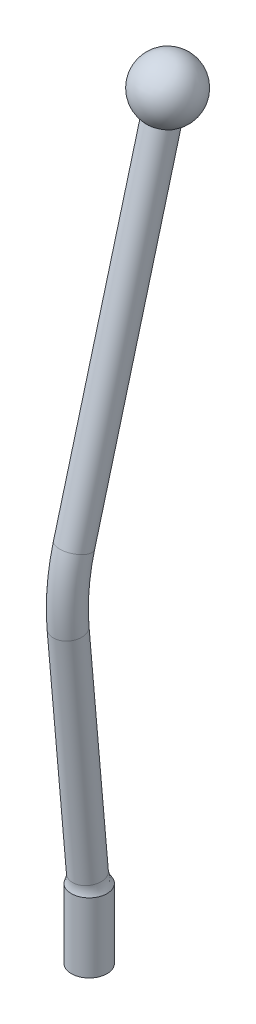
ISO-10303-21;
HEADER;
FILE_DESCRIPTION(('STEP AP214'),'2;1');
FILE_NAME('part.step','',(''),(''),'','','');
FILE_SCHEMA(('AUTOMOTIVE_DESIGN { 1 0 10303 214 1 1 1 1 }'));
ENDSEC;
DATA;
#1=APPLICATION_CONTEXT('core data for automotive mechanical design processes');
#2=APPLICATION_PROTOCOL_DEFINITION('international standard','automotive_design',2000,#1);
#3=PRODUCT_CONTEXT('',#1,'mechanical');
#4=PRODUCT('Part','Part','',(#3));
#5=PRODUCT_RELATED_PRODUCT_CATEGORY('part','',(#4));
#6=PRODUCT_DEFINITION_FORMATION('','',#4);
#7=PRODUCT_DEFINITION_CONTEXT('part definition',#1,'design');
#8=PRODUCT_DEFINITION('design','',#6,#7);
#9=PRODUCT_DEFINITION_SHAPE('','',#8);
#10=(LENGTH_UNIT() NAMED_UNIT(*) SI_UNIT(.MILLI.,.METRE.));
#11=(NAMED_UNIT(*) PLANE_ANGLE_UNIT() SI_UNIT($,.RADIAN.));
#12=(NAMED_UNIT(*) SI_UNIT($,.STERADIAN.) SOLID_ANGLE_UNIT());
#13=UNCERTAINTY_MEASURE_WITH_UNIT(LENGTH_MEASURE(1.E-05),#10,'distance_accuracy_value','');
#14=(GEOMETRIC_REPRESENTATION_CONTEXT(3) GLOBAL_UNCERTAINTY_ASSIGNED_CONTEXT((#13)) GLOBAL_UNIT_ASSIGNED_CONTEXT((#10,
#11,#12)) REPRESENTATION_CONTEXT('',''));
#15=CARTESIAN_POINT('',(0.,0.,0.));
#16=DIRECTION('',(0.,0.,1.));
#17=DIRECTION('',(1.,0.,0.));
#18=AXIS2_PLACEMENT_3D('',#15,#16,#17);
#19=CARTESIAN_POINT('',(0.,36.2652422990658,-3.9562005035831));
#20=DIRECTION('',(0.,-0.965925826289069,0.258819045102518));
#21=DIRECTION('',(0.,-0.258819045102518,-0.965925826289069));
#22=AXIS2_PLACEMENT_3D('',#19,#20,#21);
#23=CYLINDRICAL_SURFACE('',#22,0.75);
#24=CARTESIAN_POINT('',(0.,18.6499136186632,0.763812590739514));
#25=DIRECTION('',(0.,0.965925826289069,-0.258819045102518));
#26=DIRECTION('',(0.,0.258819045102518,0.965925826289069));
#27=AXIS2_PLACEMENT_3D('',#24,#25,#26);
#28=CIRCLE('',#27,0.75);
#29=CARTESIAN_POINT('',(0.,18.8440279024901,1.48825696045632));
#30=VERTEX_POINT('',#29);
#31=EDGE_CURVE('E133',#30,#30,#28,.T.);
#32=ORIENTED_EDGE('',*,*,#31,.T.);
#33=EDGE_LOOP('',(#32));
#34=FACE_BOUND('',#33,.T.);
#35=CARTESIAN_POINT('',(0.,35.0104678434591,-3.61998470152009));
#36=DIRECTION('',(0.,0.965925826289068,-0.258819045102518));
#37=DIRECTION('',(0.,0.258819045102518,0.965925826289069));
#38=AXIS2_PLACEMENT_3D('',#35,#36,#37);
#39=CIRCLE('',#38,0.75);
#40=CARTESIAN_POINT('',(0.,35.204582127286,-2.89554033180328));
#41=VERTEX_POINT('',#40);
#42=EDGE_CURVE('E64',#41,#41,#39,.T.);
#43=ORIENTED_EDGE('',*,*,#42,.F.);
#44=EDGE_LOOP('',(#43));
#45=FACE_BOUND('',#44,.T.);
#46=ADVANCED_FACE('F52',(#34,#45),#23,.T.);
#47=CARTESIAN_POINT('',(0.,3.5,0.));
#48=DIRECTION('',(0.,-1.,0.));
#49=DIRECTION('',(0.,0.,-1.));
#50=AXIS2_PLACEMENT_3D('',#47,#48,#49);
#51=CYLINDRICAL_SURFACE('',#50,0.9);
#52=CARTESIAN_POINT('',(0.,3.5,0.));
#53=DIRECTION('',(0.,1.,0.));
#54=DIRECTION('',(0.,0.,1.));
#55=AXIS2_PLACEMENT_3D('',#52,#53,#54);
#56=CIRCLE('',#55,0.9);
#57=CARTESIAN_POINT('',(0.,3.5,0.9));
#58=VERTEX_POINT('',#57);
#59=EDGE_CURVE('E69',#58,#58,#56,.T.);
#60=ORIENTED_EDGE('',*,*,#59,.F.);
#61=EDGE_LOOP('',(#60));
#62=FACE_BOUND('',#61,.T.);
#63=CARTESIAN_POINT('',(0.,0.,0.));
#64=DIRECTION('',(0.,1.,0.));
#65=DIRECTION('',(0.,0.,1.));
#66=AXIS2_PLACEMENT_3D('',#63,#64,#65);
#67=CIRCLE('',#66,0.9);
#68=CARTESIAN_POINT('',(0.,0.,0.9));
#69=VERTEX_POINT('',#68);
#70=EDGE_CURVE('E140',#69,#69,#67,.T.);
#71=ORIENTED_EDGE('',*,*,#70,.T.);
#72=EDGE_LOOP('',(#71));
#73=FACE_BOUND('',#72,.T.);
#74=ADVANCED_FACE('F85',(#62,#73),#51,.T.);
#75=CARTESIAN_POINT('',(0.,0.,0.));
#76=DIRECTION('',(0.,1.,0.));
#77=DIRECTION('',(0.,0.,1.));
#78=AXIS2_PLACEMENT_3D('',#75,#76,#77);
#79=PLANE('',#78);
#80=ORIENTED_EDGE('',*,*,#70,.F.);
#81=EDGE_LOOP('',(#80));
#82=FACE_BOUND('',#81,.T.);
#83=ADVANCED_FACE('F99',(#82),#79,.F.);
#84=CARTESIAN_POINT('',(0.,16.0617231676381,-8.89544567215118));
#85=DIRECTION('',(1.,0.,0.));
#86=DIRECTION('',(0.,0.,-1.));
#87=AXIS2_PLACEMENT_3D('',#84,#85,#86);
#88=TOROIDAL_SURFACE('',#87,10.,0.75);
#89=CARTESIAN_POINT('',(0.,15.1901657401614,1.06650130876628));
#90=DIRECTION('',(0.,0.996194698091745,0.0871557427476618));
#91=DIRECTION('',(0.,-0.0871557427476618,0.996194698091745));
#92=AXIS2_PLACEMENT_3D('',#89,#90,#91);
#93=CIRCLE('',#92,0.75);
#94=CARTESIAN_POINT('',(0.,15.1247989331007,1.81364733233508));
#95=VERTEX_POINT('',#94);
#96=EDGE_CURVE('E135',#95,#95,#93,.T.);
#97=CARTESIAN_POINT('',(0.,16.0617231676381,-8.89544567215118));
#98=DIRECTION('',(1.,0.,0.));
#99=DIRECTION('',(0.,0.,-1.));
#100=AXIS2_PLACEMENT_3D('',#97,#98,#99);
#101=CIRCLE('',#100,10.75);
#102=EDGE_CURVE('',#30,#95,#101,.T.);
#103=ORIENTED_EDGE('',*,*,#31,.F.);
#104=ORIENTED_EDGE('',*,*,#96,.T.);
#105=ORIENTED_EDGE('',*,*,#102,.T.);
#106=ORIENTED_EDGE('',*,*,#102,.F.);
#107=EDGE_LOOP('',(#103,#105,#104,#106));
#108=FACE_BOUND('',#107,.T.);
#109=ADVANCED_FACE('F101',(#108),#88,.T.);
#110=CARTESIAN_POINT('',(0.,15.1901657401614,1.06650130876628));
#111=DIRECTION('',(0.,-0.996194698091745,-0.0871557427476618));
#112=DIRECTION('',(0.,0.0871557427476618,-0.996194698091745));
#113=AXIS2_PLACEMENT_3D('',#110,#111,#112);
#114=CYLINDRICAL_SURFACE('',#113,0.75);
#115=CARTESIAN_POINT('',(-0.144872667138707,3.5,-0.888263423943661));
#116=CARTESIAN_POINT('',(-0.115218979068074,3.7449720550312,-0.678751725801336));
#117=CARTESIAN_POINT('',(-0.114300684691541,4.06745761710978,-0.650680038869771));
#118=CARTESIAN_POINT('',(-0.0921290847948509,3.5,-0.896865659609374));
#119=CARTESIAN_POINT('',(-0.0732203150959252,3.74494257312841,-0.685308371712841));
#120=CARTESIAN_POINT('',(-0.0726260908254395,4.06773638086897,-0.657106512070039));
#121=CARTESIAN_POINT('',(-0.0385680250151286,3.5,-0.900762479133432));
#122=CARTESIAN_POINT('',(-0.0306578251667123,3.74492808347658,-0.688272402079474));
#123=CARTESIAN_POINT('',(-0.030408063894286,4.06786046684401,-0.660010106207976));
#124=CARTESIAN_POINT('',(0.0683853922307064,3.5,-0.898990538536582));
#125=CARTESIAN_POINT('',(0.0543580869416777,3.74493445469587,-0.686923323321481));
#126=CARTESIAN_POINT('',(0.0539162003488046,4.06780362065552,-0.65868832751363));
#127=CARTESIAN_POINT('',(0.121777749802248,3.5,-0.893321784394758));
#128=CARTESIAN_POINT('',(0.0968027553074198,3.74495531421322,-0.682610496743229));
#129=CARTESIAN_POINT('',(0.0960224377306007,4.06762268868265,-0.654462959137398));
#130=CARTESIAN_POINT('',(0.226594251026295,3.5,-0.872644508895545));
#131=CARTESIAN_POINT('',(0.180321752548202,3.7450245796286,-0.666844379036505));
#132=CARTESIAN_POINT('',(0.178924007320642,4.06694955779518,-0.639005044529493));
#133=CARTESIAN_POINT('',(0.278018567537331,3.5,-0.85763680981144));
#134=CARTESIAN_POINT('',(0.221388014643473,3.74507296989536,-0.655394917203849));
#135=CARTESIAN_POINT('',(0.219719454608505,4.06645738628446,-0.627773115209678));
#136=CARTESIAN_POINT('',(0.377210198895163,3.5,-0.818870053771162));
#137=CARTESIAN_POINT('',(0.30094916877028,3.74517715515741,-0.625718638670664));
#138=CARTESIAN_POINT('',(0.298845560735342,4.06514618564764,-0.598624309389581));
#139=CARTESIAN_POINT('',(0.424977512029575,3.5,-0.795110992717212));
#140=CARTESIAN_POINT('',(0.339437333718594,3.74523293678775,-0.607497603211231));
#141=CARTESIAN_POINT('',(0.337176218420182,4.06432715636847,-0.580707429759107));
#142=CARTESIAN_POINT('',(0.515347158256895,3.5,-0.739747148784352));
#143=CARTESIAN_POINT('',(0.412736386661724,3.74532170320439,-0.564845272572853));
#144=CARTESIAN_POINT('',(0.410288592219785,4.06234054080429,-0.538699451876313));
#145=CARTESIAN_POINT('',(0.557949016277755,3.5,-0.708141645073717));
#146=CARTESIAN_POINT('',(0.447542410548884,3.74535469167448,-0.54042116603049));
#147=CARTESIAN_POINT('',(0.445069981858308,4.06117292249332,-0.514607786356321));
#148=CARTESIAN_POINT('',(0.63671433983848,3.5,-0.638253343610531));
#149=CARTESIAN_POINT('',(0.512494035297147,3.74536104347464,-0.486110176944435));
#150=CARTESIAN_POINT('',(0.510093113617592,4.05846649975031,-0.460939737127118));
#151=CARTESIAN_POINT('',(0.672877797439985,3.5,-0.599970537625174));
#152=CARTESIAN_POINT('',(0.54263780899368,3.74533445331079,-0.456232207062442));
#153=CARTESIAN_POINT('',(0.540334850141086,4.0569276948606,-0.431363346655493));
#154=CARTESIAN_POINT('',(0.737786727199271,3.5,-0.518074899340117));
#155=CARTESIAN_POINT('',(0.597444820235736,3.74518260313488,-0.391898776604076));
#156=CARTESIAN_POINT('',(0.595425062859597,4.05346099468572,-0.367565441220676));
#157=CARTESIAN_POINT('',(0.766531050223877,3.5,-0.474461242896601));
#158=CARTESIAN_POINT('',(0.622108322119905,3.74505743278489,-0.357451747615145));
#159=CARTESIAN_POINT('',(0.620272703480544,4.05153303920819,-0.333343207924389));
#160=CARTESIAN_POINT('',(0.815909393698301,3.5,-0.383374546423862));
#161=CARTESIAN_POINT('',(0.665293516585732,3.74467204400575,-0.284983640632582));
#162=CARTESIAN_POINT('',(0.663863572528438,4.04728200444597,-0.261233596156629));
#163=CARTESIAN_POINT('',(0.836543417143693,3.5,-0.335901507820126));
#164=CARTESIAN_POINT('',(0.683819171494976,3.74441199609345,-0.246970965162744));
#165=CARTESIAN_POINT('',(0.682606803210073,4.04495892530722,-0.223346219038898));
#166=CARTESIAN_POINT('',(0.869312434344212,3.5,-0.238603334601208));
#167=CARTESIAN_POINT('',(0.714249979436468,3.74372818957266,-0.168447590437437));
#168=CARTESIAN_POINT('',(0.713457051593159,4.03992904605581,-0.144985309736049));
#169=CARTESIAN_POINT('',(0.881447225647794,3.5,-0.188778143987985));
#170=CARTESIAN_POINT('',(0.726161405501332,3.74330465523457,-0.12794359150184));
#171=CARTESIAN_POINT('',(0.725563911214886,4.03722223680456,-0.104511715972358));
#172=CARTESIAN_POINT('',(0.897104022233586,3.5,-0.088269611209037));
#173=CARTESIAN_POINT('',(0.743062206485808,3.74227754991545,-0.0455644204729688));
#174=CARTESIAN_POINT('',(0.742796686908443,4.03145928347461,-0.0221317837974536));
#175=CARTESIAN_POINT('',(0.900626026105832,3.5,-0.0375862689028292));
#176=CARTESIAN_POINT('',(0.748059832952976,3.74167424050672,-0.00369362750738556));
#177=CARTESIAN_POINT('',(0.747922601837451,4.02840313933874,0.0197745548483068));
#178=CARTESIAN_POINT('',(0.899191726937327,3.5,0.063199854900854));
#179=CARTESIAN_POINT('',(0.751010192563357,3.74028748869354,0.0802632401722699));
#180=CARTESIAN_POINT('',(0.75104740746664,4.02200293525744,0.103822459098839));
#181=CARTESIAN_POINT('',(0.894236498942816,3.5,0.113302709202127));
#182=CARTESIAN_POINT('',(0.748973031272953,3.73950432582539,0.122347790711691));
#183=CARTESIAN_POINT('',(0.74904720183609,4.01865891187069,0.145963994201499));
#184=CARTESIAN_POINT('',(0.876198875085735,3.5,0.211595099945111));
#185=CARTESIAN_POINT('',(0.737911084278625,3.73777630288877,0.205585176944913));
#186=CARTESIAN_POINT('',(0.737978348023366,4.01177206285762,0.229290614754973));
#187=CARTESIAN_POINT('',(0.863116474743562,3.5,0.259784635332206));
#188=CARTESIAN_POINT('',(0.728895474759081,3.73683164840063,0.246739625265908));
#189=CARTESIAN_POINT('',(0.728909695945145,4.00822923712171,0.270475699678589));
#190=CARTESIAN_POINT('',(0.829358272482508,3.5,0.353019762483692));
#191=CARTESIAN_POINT('',(0.70411116849934,3.73481876024883,0.326980659367714));
#192=CARTESIAN_POINT('',(0.703962561198934,4.00106250587298,0.350717787549545));
#193=CARTESIAN_POINT('',(0.808683161584001,3.5,0.398065639911778));
#194=CARTESIAN_POINT('',(0.68835119967796,3.73375064889423,0.366072024782488));
#195=CARTESIAN_POINT('',(0.688084698222156,3.99743860776682,0.389774983786861));
#196=CARTESIAN_POINT('',(0.760426951399606,3.5,0.483917043210897));
#197=CARTESIAN_POINT('',(0.650489898848964,3.73154723009053,0.441101546065638));
#198=CARTESIAN_POINT('',(0.649970410534667,3.99025150157258,0.464659342991504));
#199=CARTESIAN_POINT('',(0.73284600301273,3.5,0.524722661707991));
#200=CARTESIAN_POINT('',(0.62839478740183,3.73041190993933,0.477046889336796));
#201=CARTESIAN_POINT('',(0.627734124759939,3.9866882921602,0.500486576513276));
#202=CARTESIAN_POINT('',(0.671595324570165,3.5,0.601130151674878));
#203=CARTESIAN_POINT('',(0.578449124215004,3.72814545814495,0.544768637877516));
#204=CARTESIAN_POINT('',(0.577532983018824,3.97978255319501,0.567902232088774));
#205=CARTESIAN_POINT('',(0.637925277393976,3.5,0.636731751944494));
#206=CARTESIAN_POINT('',(0.550601545568076,3.72701418025059,0.576553697768349));
#207=CARTESIAN_POINT('',(0.549567828682666,3.9764400351482,0.599490433224196));
#208=CARTESIAN_POINT('',(0.565426816962018,3.5,0.701903275611775));
#209=CARTESIAN_POINT('',(0.48990684104598,3.72483663658915,0.635034395921996));
#210=CARTESIAN_POINT('',(0.488701663513053,3.9701445621659,0.657536815335362));
#211=CARTESIAN_POINT('',(0.526598278100678,3.5,0.731473052094394));
#212=CARTESIAN_POINT('',(0.457059578604506,3.72379011651889,0.661739511154086));
#213=CARTESIAN_POINT('',(0.455800532489588,3.96719161671971,0.68399487135716));
#214=CARTESIAN_POINT('',(0.444797143207385,3.5,0.783911696580794));
#215=CARTESIAN_POINT('',(0.387268485674949,3.72186392710654,0.709280862506685));
#216=CARTESIAN_POINT('',(0.385984982011127,3.96183848458491,0.731046001742879));
#217=CARTESIAN_POINT('',(0.401822777297987,3.5,0.806777685724226));
#218=CARTESIAN_POINT('',(0.350319481884324,3.72098401323146,0.730123770506097));
#219=CARTESIAN_POINT('',(0.349068847663833,3.95943853546829,0.751636556273225));
#220=CARTESIAN_POINT('',(0.312866844615839,3.5,0.845257043854274));
#221=CARTESIAN_POINT('',(0.273400273536247,3.71946650544807,0.765287752552796));
#222=CARTESIAN_POINT('',(0.272295953700746,3.95533881902648,0.78634913563552));
#223=CARTESIAN_POINT('',(0.266887316800292,3.5,0.860875273240078));
#224=CARTESIAN_POINT('',(0.233425667476571,3.7188284445523,0.779620789409644));
#225=CARTESIAN_POINT('',(0.232441185598961,3.95363858255586,0.800475495313718));
#226=CARTESIAN_POINT('',(0.18405273331681,3.5,0.881760351207994));
#227=CARTESIAN_POINT('',(0.16117315025673,3.71796441485551,0.798811553979258));
#228=CARTESIAN_POINT('',(0.160451902881569,3.95134697047648,0.819382799495632));
#229=CARTESIAN_POINT('',(0.147570544992068,3.5,0.888591843380579));
#230=CARTESIAN_POINT('',(0.129272268446915,3.71767695396043,0.805101559022923));
#231=CARTESIAN_POINT('',(0.128684614779542,3.95058946542695,0.825574921970027));
#232=CARTESIAN_POINT('',(0.0740605652357915,3.5,0.897711504652707));
#233=CARTESIAN_POINT('',(0.0649178885646101,3.7172918732376,0.813500702062237));
#234=CARTESIAN_POINT('',(0.0646129872745212,3.94957595257382,0.833843199092549));
#235=CARTESIAN_POINT('',(0.0370328583522,3.5,0.900000370487855));
#236=CARTESIAN_POINT('',(0.0324600384123579,3.71719417046807,0.815611660966947));
#237=CARTESIAN_POINT('',(0.0323087309967825,3.94931986786382,0.835919984939677));
#238=CARTESIAN_POINT('',(-0.0415279661363101,3.5,0.899999584541533));
#239=CARTESIAN_POINT('',(-0.0364000975805582,3.71719425842003,0.815610770581823));
#240=CARTESIAN_POINT('',(-0.0362304341712133,3.94932004259116,0.835919193498331));
#241=CARTESIAN_POINT('',(-0.083062407791829,3.5,0.897120459163166));
#242=CARTESIAN_POINT('',(-0.0728090997894153,3.71731721921393,0.812955221224301));
#243=CARTESIAN_POINT('',(-0.0724664952923273,3.94964226451806,0.833306752102245));
#244=CARTESIAN_POINT('',(-0.165318929738215,3.5,0.885660152777633));
#245=CARTESIAN_POINT('',(-0.144797762320536,3.71780024927811,0.802402586986923));
#246=CARTESIAN_POINT('',(-0.14414389109703,3.95091444964466,0.82291769578813));
#247=CARTESIAN_POINT('',(-0.206041612929214,3.5,0.877083379370847));
#248=CARTESIAN_POINT('',(-0.180384241347275,3.71816021986515,0.794507694610468));
#249=CARTESIAN_POINT('',(-0.179585818217882,3.95186392760697,0.815145072698903));
#250=CARTESIAN_POINT('',(-0.292537206961567,3.5,0.852501838816908));
#251=CARTESIAN_POINT('',(-0.255733085341615,3.71916992816754,0.771939146224981));
#252=CARTESIAN_POINT('',(-0.254680939147091,3.95454922870688,0.79290295429743));
#253=CARTESIAN_POINT('',(-0.33804198892276,3.5,0.83550895718048));
#254=CARTESIAN_POINT('',(-0.295227499290498,3.71985772220039,0.756361075580953));
#255=CARTESIAN_POINT('',(-0.294070562786826,3.95638853749378,0.777543681210248));
#256=CARTESIAN_POINT('',(-0.425825637649131,3.5,0.794370256162688));
#257=CARTESIAN_POINT('',(-0.370972875628092,3.72146171555668,0.718815228598848));
#258=CARTESIAN_POINT('',(-0.369701006114158,3.96074128388087,0.74046378236587));
#259=CARTESIAN_POINT('',(-0.468103491222962,3.5,0.770222201723343));
#260=CARTESIAN_POINT('',(-0.407228755854986,3.72237829882313,0.696837482473736));
#261=CARTESIAN_POINT('',(-0.405940837320997,3.96325493210092,0.718741168919159));
#262=CARTESIAN_POINT('',(-0.548332745886319,3.5,0.715327318123665));
#263=CARTESIAN_POINT('',(-0.475470138452294,3.72436319949453,0.647155577849922));
#264=CARTESIAN_POINT('',(-0.474237005570385,3.96880679649227,0.669545873386423));
#265=CARTESIAN_POINT('',(-0.586284252475975,3.5,0.68458064992655));
#266=CARTESIAN_POINT('',(-0.507458536559521,3.72543182283475,0.619442212339875));
#267=CARTESIAN_POINT('',(-0.5062934446298,3.97184499986748,0.642073331561621));
#268=CARTESIAN_POINT('',(-0.656845921652987,3.5,0.617197891210582));
#269=CARTESIAN_POINT('',(-0.566282039611926,3.72763822648029,0.559106683524192));
#270=CARTESIAN_POINT('',(-0.56530972768512,3.97827954807053,0.582152859523101));
#271=CARTESIAN_POINT('',(-0.689456448148919,3.5,0.580562202278455));
#272=CARTESIAN_POINT('',(-0.593116882284938,3.72877624120263,0.526475301502753));
#273=CARTESIAN_POINT('',(-0.59226991893404,3.98167586847206,0.549705268577108));
#274=CARTESIAN_POINT('',(-0.748429505407704,3.5,0.502250793835982));
#275=CARTESIAN_POINT('',(-0.640918012902324,3.73104217071969,0.457238675779747));
#276=CARTESIAN_POINT('',(-0.640332984007674,3.98865889465661,0.480746019470724));
#277=CARTESIAN_POINT('',(-0.774791719410011,3.5,0.460574818968134));
#278=CARTESIAN_POINT('',(-0.661880159104417,3.73217020764027,0.42062461338799));
#279=CARTESIAN_POINT('',(-0.661435560887709,3.99224561008051,0.444234155408323));
#280=CARTESIAN_POINT('',(-0.820469816034957,3.5,0.373176123176331));
#281=CARTESIAN_POINT('',(-0.69738440950543,3.73434732935681,0.344453809417638));
#282=CARTESIAN_POINT('',(-0.69718237308844,3.999451730974,0.368178860586411));
#283=CARTESIAN_POINT('',(-0.839785618536582,3.5,0.327453356245792));
#284=CARTESIAN_POINT('',(-0.711919913076409,3.73539640286407,0.304890330571113));
#285=CARTESIAN_POINT('',(-0.711826534974315,4.00307113681482,0.328635395362355));
#286=CARTESIAN_POINT('',(-0.870708260431093,3.5,0.233091637572721));
#287=CARTESIAN_POINT('',(-0.73419457982588,3.73736249706891,0.223919412466918));
#288=CARTESIAN_POINT('',(-0.734239050493792,4.01020432265257,0.247641537534596));
#289=CARTESIAN_POINT('',(-0.882315960842757,3.5,0.184453012202549));
#290=CARTESIAN_POINT('',(-0.741926116157074,3.73827940125211,0.18250810635731));
#291=CARTESIAN_POINT('',(-0.742008172122854,4.01371811440504,0.206191358469983));
#292=CARTESIAN_POINT('',(-0.89732546334387,3.5,0.08550328300072));
#293=CARTESIAN_POINT('',(-0.750397087432462,3.73994705838918,0.0989690827472001));
#294=CARTESIAN_POINT('',(-0.75045288259098,4.02052814354794,0.122555734398393));
#295=CARTESIAN_POINT('',(-0.900727278250952,3.5,0.0351921817816026));
#296=CARTESIAN_POINT('',(-0.751127270400988,3.74069759299597,0.0568403306649255));
#297=CARTESIAN_POINT('',(-0.751128482510164,4.02382438127817,0.0803702905400069));
#298=CARTESIAN_POINT('',(-0.899013455927284,3.5,-0.0657419735632669));
#299=CARTESIAN_POINT('',(-0.745573118820044,3.74201767508038,-0.0269844193986832));
#300=CARTESIAN_POINT('',(-0.745367379848269,4.03011503951028,-0.00353545627798036));
#301=CARTESIAN_POINT('',(-0.893898228887664,3.5,-0.116365012548731));
#302=CARTESIAN_POINT('',(-0.73928001880812,3.74258697055354,-0.0686783904155607));
#303=CARTESIAN_POINT('',(-0.73893101979288,4.03310947453997,-0.0452557815408433));
#304=CARTESIAN_POINT('',(-0.875060248015658,3.5,-0.21648015714968));
#305=CARTESIAN_POINT('',(-0.719833156099086,3.74354802920135,-0.150494357126746));
#306=CARTESIAN_POINT('',(-0.719129562058335,4.03874088435196,-0.127046808742511));
#307=CARTESIAN_POINT('',(-0.861337490656567,3.5,-0.265972262301788));
#308=CARTESIAN_POINT('',(-0.706671421693598,3.7439395345319,-0.190611488402203));
#309=CARTESIAN_POINT('',(-0.705764461540314,4.0413778589878,-0.167117510005419));
#310=CARTESIAN_POINT('',(-0.82544458299547,3.5,-0.362331991979058));
#311=CARTESIAN_POINT('',(-0.673815323525678,3.7445638829356,-0.268164202495584));
#312=CARTESIAN_POINT('',(-0.672483326549712,4.0462648533399,-0.244472509346311));
#313=CARTESIAN_POINT('',(-0.803273549438077,3.5,-0.409199341501882));
#314=CARTESIAN_POINT('',(-0.654114266716889,3.74479649061999,-0.305592376286326));
#315=CARTESIAN_POINT('',(-0.652566607144375,4.04851483256061,-0.281756515591571));
#316=CARTESIAN_POINT('',(-0.750926846728082,3.5,-0.498799077305133));
#317=CARTESIAN_POINT('',(-0.608686540381843,3.74513329456589,-0.376700903333533));
#318=CARTESIAN_POINT('',(-0.60674792629236,4.05261973477514,-0.352470784267088));
#319=CARTESIAN_POINT('',(-0.720751168995867,3.5,-0.541531459153513));
#320=CARTESIAN_POINT('',(-0.582956412817536,3.74523733229071,-0.410372645325003));
#321=CARTESIAN_POINT('',(-0.580845958430521,4.05447465734551,-0.385901042566729));
#322=CARTESIAN_POINT('',(-0.653131458537025,3.5,-0.621415885183773));
#323=CARTESIAN_POINT('',(-0.526148389777399,3.74535410090907,-0.47299141339122));
#324=CARTESIAN_POINT('',(-0.523788160500316,4.05779843508201,-0.447957782692566));
#325=CARTESIAN_POINT('',(-0.615686527696735,3.5,-0.658567238824493));
#326=CARTESIAN_POINT('',(-0.495069272651427,3.74536672727013,-0.501928674071486));
#327=CARTESIAN_POINT('',(-0.492631681301423,4.0592672424909,-0.476583670124769));
#328=CARTESIAN_POINT('',(-0.534570265346774,3.5,-0.725957701383306));
#329=CARTESIAN_POINT('',(-0.428414456855586,3.74533953560648,-0.554205807574348));
#330=CARTESIAN_POINT('',(-0.425951220716144,4.06183754373629,-0.528208744658726));
#331=CARTESIAN_POINT('',(-0.490898935075128,3.5,-0.756196811675789));
#332=CARTESIAN_POINT('',(-0.392841108795862,3.74529968008223,-0.577536903478561));
#333=CARTESIAN_POINT('',(-0.390427240198168,4.06293903764584,-0.551207932879261));
#334=CARTESIAN_POINT('',(-0.398649176762122,3.5,-0.808636775881285));
#335=CARTESIAN_POINT('',(-0.318199613734555,3.74520337755615,-0.617881824088443));
#336=CARTESIAN_POINT('',(-0.316021022095535,4.06479759580854,-0.590921184581228));
#337=CARTESIAN_POINT('',(-0.350070888517205,3.5,-0.830837858710568));
#338=CARTESIAN_POINT('',(-0.2791365499381,3.74514693044738,-0.63488837425285));
#339=CARTESIAN_POINT('',(-0.277138880187558,4.06555466987064,-0.607635427053158));
#340=CARTESIAN_POINT('',(-0.249558531077092,3.5,-0.86634939058087));
#341=CARTESIAN_POINT('',(-0.198641396073872,3.74504600237512,-0.662047771726178));
#342=CARTESIAN_POINT('',(-0.197119253068243,4.06674527677205,-0.634301113767734));
#343=CARTESIAN_POINT('',(-0.197624465171437,3.5,-0.879659848336885));
#344=CARTESIAN_POINT('',(-0.157216372063971,3.74500153604181,-0.672195278309029));
#345=CARTESIAN_POINT('',(-0.155981770067736,4.06717880992851,-0.644252564639576));
#346=CARTESIAN_POINT('',(-0.144872667138707,3.5,-0.888263423943661));
#347=CARTESIAN_POINT('',(-0.115218979068074,3.7449720550312,-0.678751725801336));
#348=CARTESIAN_POINT('',(-0.114300684691541,4.06745761710978,-0.650680038869771));
#349=(BOUNDED_SURFACE() B_SPLINE_SURFACE(3,2,((#115,#116,#117),(#118,#119,#120),(#121,#122,
#123),(#124,#125,#126),(#127,#128,#129),(#130,#131,#132),(#133,#134,#135),(#136,#137,#138),
(#139,#140,#141),(#142,#143,#144),(#145,#146,#147),(#148,#149,#150),(#151,#152,#153),(#154,#155,
#156),(#157,#158,#159),(#160,#161,#162),(#163,#164,#165),(#166,#167,#168),(#169,#170,#171),
(#172,#173,#174),(#175,#176,#177),(#178,#179,#180),(#181,#182,#183),(#184,#185,#186),(#187,#188,
#189),(#190,#191,#192),(#193,#194,#195),(#196,#197,#198),(#199,#200,#201),(#202,#203,#204),
(#205,#206,#207),(#208,#209,#210),(#211,#212,#213),(#214,#215,#216),(#217,#218,#219),(#220,#221,
#222),(#223,#224,#225),(#226,#227,#228),(#229,#230,#231),(#232,#233,#234),(#235,#236,#237),
(#238,#239,#240),(#241,#242,#243),(#244,#245,#246),(#247,#248,#249),(#250,#251,#252),(#253,#254,
#255),(#256,#257,#258),(#259,#260,#261),(#262,#263,#264),(#265,#266,#267),(#268,#269,#270),
(#271,#272,#273),(#274,#275,#276),(#277,#278,#279),(#280,#281,#282),(#283,#284,#285),(#286,#287,
#288),(#289,#290,#291),(#292,#293,#294),(#295,#296,#297),(#298,#299,#300),(#301,#302,#303),
(#304,#305,#306),(#307,#308,#309),(#310,#311,#312),(#313,#314,#315),(#316,#317,#318),(#319,#320,
#321),(#322,#323,#324),(#325,#326,#327),(#328,#329,#330),(#331,#332,#333),(#334,#335,#336),
(#337,#338,#339),(#340,#341,#342),(#343,#344,#345),(#346,#347,#348)),.UNSPECIFIED.,.T.,.F.,
.F.) B_SPLINE_SURFACE_WITH_KNOTS((4,2,2,2,2,2,2,2,2,2,2,2,2,2,2,2,2,2,2,2,2,2,2,2,2,2,2,2,2,2,2,
2,2,2,2,2,2,2,4),(3,3),(0.,0.294822732336767,0.589645280390885,0.884441873649072,
1.17923860494426,1.47406242845555,1.76888661547351,2.06375643978516,2.3586261551853,
2.65350289413751,2.94837968136279,3.24321907634871,3.53805863384684,3.83287136434185,
4.12767765346488,4.42249930053468,4.71732812761616,5.01228338053415,5.30704054750325,
5.53305497173424,5.75903472781111,6.01244439213327,6.26565825111665,6.56043235509828,
6.85529863477442,7.15015772245035,7.44499671148735,7.73985064430201,8.03470792964014,
8.32953227296719,8.62435615577689,8.91916583991945,9.21397564485247,9.50881628019608,
9.80365723155984,10.0985346336293,10.3934119770669,10.6882809219848,10.9831495778583),(0.,1.),
.UNSPECIFIED.) GEOMETRIC_REPRESENTATION_ITEM() RATIONAL_B_SPLINE_SURFACE(((1.,0.951395204661457,
1.),(1.,0.95130672359878,1.),(1.,0.951266822413838,1.),(1.,0.951285000952774,1.),(1.,
0.951343080615409,1.),(1.,0.951556014948018,1.),(1.,0.951710861097925,1.),(1.,0.952114096004687,
1.),(1.,0.952362484805344,1.),(1.,0.952947544125396,1.),(1.,0.953284222755901,1.),(1.,
0.954038465450573,1.),(1.,0.954456029614468,1.),(1.,0.955362612097901,1.),(1.,0.955851641468177,
1.),(1.,0.956889508731551,1.),(1.,0.957438346602559,1.),(1.,0.958582241303977,1.),(1.,
0.959177299234972,1.),(1.,0.960398183101371,1.),(1.,0.961024009041812,1.),(1.,0.962289340453114,
1.),(1.,0.962928844179261,1.),(1.,0.964203421066414,1.),(1.,0.964838494224978,1.),(1.,
0.966085270961219,1.),(1.,0.96669697666,1.),(1.,0.967878100809505,1.),(1.,0.968447520183871,1.),
(1.,0.969525752555161,1.),(1.,0.970034562393247,1.),(1.,0.970974550478257,1.),(1.,
0.971405726834258,1.),(1.,0.972175725640806,1.),(1.,0.972514508409699,1.),(1.,0.97308730644118,
1.),(1.,0.973321391910698,1.),(1.,0.973635185090934,1.),(1.,0.973738164426435,1.),(1.,
0.973875732894113,1.),(1.,0.973910332514181,1.),(1.,0.973910317013757,1.),(1.,0.973866790681508,
1.),(1.,0.973693975326642,1.),(1.,0.973564752597384,1.),(1.,0.973195933859337,1.),(1.,
0.972941703302694,1.),(1.,0.972330667227478,1.),(1.,0.971973829658632,1.),(1.,0.971170181638849,
1.),(1.,0.970723373382626,1.),(1.,0.969755141333694,1.),(1.,0.96923372262912,1.),(1.,
0.968133535283185,1.),(1.,0.967554763736409,1.),(1.,0.966358424784938,1.),(1.,0.965740856939204,
1.),(1.,0.964486009710094,1.),(1.,0.963848732536636,1.),(1.,0.962573193979232,1.),(1.,
0.961934932596825,1.),(1.,0.960675453513601,1.),(1.,0.960054234993442,1.),(1.,0.95884554012364,
1.),(1.,0.958258063787821,1.),(1.,0.957131900770659,1.),(1.,0.95659321919803,1.),(1.,
0.955577953040603,1.),(1.,0.955101368522363,1.),(1.,0.954221453519306,1.),(1.,0.953818132098051,
1.),(1.,0.953093931723452,1.),(1.,0.952773052753717,1.),(1.,0.952220743931075,1.),(1.,
0.951989311530793,1.),(1.,0.951620789364759,1.),(1.,0.951483699506528,1.),(1.,0.951395204661457,1.))) REPRESENTATION_ITEM('') SURFACE());
#350=CARTESIAN_POINT('',(-0.114300684691541,4.06745761710978,-0.650680038869771));
#351=CARTESIAN_POINT('',(-0.155981770067735,4.06717880992851,-0.644252564639576));
#352=CARTESIAN_POINT('',(-0.197119253068243,4.06674527677205,-0.634301113767734));
#353=CARTESIAN_POINT('',(-0.277138880187558,4.06555466987064,-0.607635427053158));
#354=CARTESIAN_POINT('',(-0.316021022095535,4.06479759580854,-0.590921184581228));
#355=CARTESIAN_POINT('',(-0.390427240198168,4.06293903764584,-0.551207932879261));
#356=CARTESIAN_POINT('',(-0.425951220716144,4.06183754373629,-0.528208744658726));
#357=CARTESIAN_POINT('',(-0.492631681301423,4.0592672424909,-0.476583670124769));
#358=CARTESIAN_POINT('',(-0.523788160500316,4.05779843508201,-0.447957782692566));
#359=CARTESIAN_POINT('',(-0.580845958430521,4.05447465734551,-0.385901042566729));
#360=CARTESIAN_POINT('',(-0.60674792629236,4.05261973477514,-0.352470784267087));
#361=CARTESIAN_POINT('',(-0.652566607144375,4.04851483256061,-0.281756515591571));
#362=CARTESIAN_POINT('',(-0.672483326549712,4.0462648533399,-0.244472509346312));
#363=CARTESIAN_POINT('',(-0.705764461540314,4.0413778589878,-0.167117510005419));
#364=CARTESIAN_POINT('',(-0.719129562058335,4.03874088435196,-0.127046808742511));
#365=CARTESIAN_POINT('',(-0.73893101979288,4.03310947453997,-0.0452557815408432));
#366=CARTESIAN_POINT('',(-0.745367379848269,4.03011503951028,-0.0035354562779804));
#367=CARTESIAN_POINT('',(-0.751128482510164,4.02382438127817,0.0803702905400069));
#368=CARTESIAN_POINT('',(-0.75045288259098,4.02052814354794,0.122555734398393));
#369=CARTESIAN_POINT('',(-0.742008172122854,4.01371811440504,0.206191358469983));
#370=CARTESIAN_POINT('',(-0.734239050493792,4.01020432265257,0.247641537534596));
#371=CARTESIAN_POINT('',(-0.711826534974315,4.00307113681482,0.328635395362355));
#372=CARTESIAN_POINT('',(-0.69718237308844,3.999451730974,0.368178860586411));
#373=CARTESIAN_POINT('',(-0.661435560887709,3.99224561008051,0.444234155408323));
#374=CARTESIAN_POINT('',(-0.640332984007674,3.98865889465661,0.480746019470724));
#375=CARTESIAN_POINT('',(-0.59226991893404,3.98167586847206,0.549705268577108));
#376=CARTESIAN_POINT('',(-0.56530972768512,3.97827954807053,0.582152859523101));
#377=CARTESIAN_POINT('',(-0.5062934446298,3.97184499986748,0.642073331561621));
#378=CARTESIAN_POINT('',(-0.474237005570385,3.96880679649227,0.669545873386423));
#379=CARTESIAN_POINT('',(-0.405940837320997,3.96325493210092,0.718741168919159));
#380=CARTESIAN_POINT('',(-0.369701006114158,3.96074128388087,0.74046378236587));
#381=CARTESIAN_POINT('',(-0.294070562786826,3.95638853749378,0.777543681210248));
#382=CARTESIAN_POINT('',(-0.254680939147091,3.95454922870688,0.79290295429743));
#383=CARTESIAN_POINT('',(-0.179585818217882,3.95186392760697,0.815145072698903));
#384=CARTESIAN_POINT('',(-0.14414389109703,3.95091444964466,0.82291769578813));
#385=CARTESIAN_POINT('',(-0.0724664952923273,3.94964226451806,0.833306752102245));
#386=CARTESIAN_POINT('',(-0.0362304341712133,3.94932004259116,0.835919193498331));
#387=CARTESIAN_POINT('',(0.0323087309967825,3.94931986786382,0.835919984939677));
#388=CARTESIAN_POINT('',(0.0646129872745213,3.94957595257382,0.833843199092549));
#389=CARTESIAN_POINT('',(0.128684614779542,3.95058946542695,0.825574921970027));
#390=CARTESIAN_POINT('',(0.160451902881569,3.95134697047648,0.819382799495632));
#391=CARTESIAN_POINT('',(0.232441185598961,3.95363858255586,0.800475495313718));
#392=CARTESIAN_POINT('',(0.272295953700746,3.95533881902648,0.78634913563552));
#393=CARTESIAN_POINT('',(0.349068847663833,3.95943853546829,0.751636556273225));
#394=CARTESIAN_POINT('',(0.385984982011127,3.96183848458491,0.731046001742879));
#395=CARTESIAN_POINT('',(0.455800532489588,3.96719161671971,0.68399487135716));
#396=CARTESIAN_POINT('',(0.488701663513054,3.97014456216589,0.657536815335362));
#397=CARTESIAN_POINT('',(0.549567828682666,3.9764400351482,0.599490433224196));
#398=CARTESIAN_POINT('',(0.577532983018824,3.97978255319501,0.567902232088774));
#399=CARTESIAN_POINT('',(0.627734124759939,3.9866882921602,0.500486576513276));
#400=CARTESIAN_POINT('',(0.649970410534667,3.99025150157258,0.464659342991504));
#401=CARTESIAN_POINT('',(0.688084698222155,3.99743860776682,0.389774983786861));
#402=CARTESIAN_POINT('',(0.703962561198934,4.00106250587298,0.350717787549545));
#403=CARTESIAN_POINT('',(0.728909695945145,4.00822923712171,0.270475699678589));
#404=CARTESIAN_POINT('',(0.737978348023366,4.01177206285762,0.229290614754973));
#405=CARTESIAN_POINT('',(0.74904720183609,4.01865891187069,0.145963994201499));
#406=CARTESIAN_POINT('',(0.75104740746664,4.02200293525743,0.103822459098839));
#407=CARTESIAN_POINT('',(0.747922601837451,4.02840313933874,0.0197745548483069));
#408=CARTESIAN_POINT('',(0.742796686908443,4.03145928347461,-0.0221317837974534));
#409=CARTESIAN_POINT('',(0.725563911214886,4.03722223680456,-0.104511715972358));
#410=CARTESIAN_POINT('',(0.713457051593159,4.03992904605581,-0.14498530973605));
#411=CARTESIAN_POINT('',(0.682606803210073,4.04495892530722,-0.223346219038898));
#412=CARTESIAN_POINT('',(0.663863572528438,4.04728200444597,-0.261233596156629));
#413=CARTESIAN_POINT('',(0.620272703480544,4.05153303920819,-0.333343207924389));
#414=CARTESIAN_POINT('',(0.595425062859597,4.05346099468572,-0.367565441220676));
#415=CARTESIAN_POINT('',(0.540334850141086,4.0569276948606,-0.431363346655493));
#416=CARTESIAN_POINT('',(0.510093113617592,4.05846649975031,-0.460939737127118));
#417=CARTESIAN_POINT('',(0.445069981858308,4.06117292249332,-0.514607786356321));
#418=CARTESIAN_POINT('',(0.410288592219784,4.06234054080429,-0.538699451876313));
#419=CARTESIAN_POINT('',(0.337176218420182,4.06432715636847,-0.580707429759107));
#420=CARTESIAN_POINT('',(0.298845560735342,4.06514618564764,-0.598624309389581));
#421=CARTESIAN_POINT('',(0.219719454608505,4.06645738628447,-0.627773115209678));
#422=CARTESIAN_POINT('',(0.178924007320642,4.06694955779518,-0.639005044529493));
#423=CARTESIAN_POINT('',(0.0960224377306006,4.06762268868265,-0.654462959137398));
#424=CARTESIAN_POINT('',(0.0539162003488045,4.06780362065552,-0.65868832751363));
#425=CARTESIAN_POINT('',(-0.0304080638942861,4.06786046684401,-0.660010106207975));
#426=CARTESIAN_POINT('',(-0.0726260908254395,4.06773638086897,-0.657106512070039));
#427=CARTESIAN_POINT('',(-0.114300684691541,4.06745761710978,-0.650680038869771));
#428=B_SPLINE_CURVE_WITH_KNOTS('',3,(#350,#351,#352,#353,#354,#355,#356,#357,#358,#359,#360,
#361,#362,#363,#364,#365,#366,#367,#368,#369,#370,#371,#372,#373,#374,#375,#376,#377,#378,#379,
#380,#381,#382,#383,#384,#385,#386,#387,#388,#389,#390,#391,#392,#393,#394,#395,#396,#397,#398,
#399,#400,#401,#402,#403,#404,#405,#406,#407,#408,#409,#410,#411,#412,#413,#414,#415,#416,#417,
#418,#419,#420,#421,#422,#423,#424,#425,#426,#427),.UNSPECIFIED.,.T.,.F.,(4,2,2,2,2,2,2,2,2,2,2,
2,2,2,2,2,2,2,2,2,2,2,2,2,2,2,2,2,2,2,2,2,2,2,2,2,2,2,4),(0.,0.294868655873509,
0.589737600791406,0.884614944229006,1.17949234629842,1.47433329766218,1.76917393300579,
2.0639837379388,2.35879342208136,2.65361730489107,2.94844164821812,3.24329893355625,
3.53815286637091,3.83299185540791,4.12785094308384,4.42271722275998,4.7174913267416,
4.97070518572499,5.22411485004715,5.45009460612402,5.676109030355,5.97086619732411,
6.2658214502421,6.56065027732358,6.85547192439337,7.15027821351641,7.44509094401142,
7.73993050150954,8.03476989649547,8.32964668372075,8.62452342267296,8.9193931380731,
9.21426296238475,9.50908714940271,9.80391097291399,10.0987077042092,10.3935042974674,
10.6883268455215,10.9831495778583),.UNSPECIFIED.);
#429=CARTESIAN_POINT('',(-0.114300684691541,4.06745761710978,-0.650680038869771));
#430=VERTEX_POINT('',#429);
#431=EDGE_CURVE('E11',#430,#430,#428,.T.);
#432=ORIENTED_EDGE('',*,*,#431,.T.);
#433=EDGE_LOOP('',(#432));
#434=FACE_BOUND('',#433,.T.);
#435=ORIENTED_EDGE('',*,*,#96,.F.);
#436=EDGE_LOOP('',(#435));
#437=FACE_BOUND('',#436,.T.);
#438=ADVANCED_FACE('F78',(#434,#437),#114,.T.);
#439=CARTESIAN_POINT('',(0.,36.2652422990658,-3.9562005035831));
#440=DIRECTION('',(1.,0.,0.));
#441=DIRECTION('',(0.,-0.258819045102519,-0.965925826289069));
#442=AXIS2_PLACEMENT_3D('',#439,#440,#441);
#443=SPHERICAL_SURFACE('',#442,1.5);
#444=CARTESIAN_POINT('',(0.,36.2652422990658,-3.9562005035831));
#445=DIRECTION('',(0.,0.965925826289069,-0.258819045102518));
#446=DIRECTION('',(0.,0.258819045102518,0.965925826289069));
#447=AXIS2_PLACEMENT_3D('',#444,#445,#446);
#448=SPHERICAL_SURFACE('',#447,1.5);
#449=ORIENTED_EDGE('',*,*,#42,.T.);
#450=EDGE_LOOP('',(#449));
#451=FACE_BOUND('',#450,.T.);
#452=ADVANCED_FACE('F92',(#451),#448,.T.);
#453=ORIENTED_EDGE('',*,*,#431,.F.);
#454=EDGE_LOOP('',(#453));
#455=FACE_BOUND('',#454,.T.);
#456=ORIENTED_EDGE('',*,*,#59,.T.);
#457=EDGE_LOOP('',(#456));
#458=FACE_BOUND('',#457,.T.);
#459=ADVANCED_FACE('F88',(#455,#458),#349,.F.);
#460=CLOSED_SHELL('',(#46,#74,#83,#109,#438,#452,#459));
#461=CARTESIAN_POINT('',(0.,36.2652422990658,-3.9562005035831));
#462=DIRECTION('',(1.,0.,0.));
#463=DIRECTION('',(0.,0.258819045102519,0.965925826289069));
#464=AXIS2_PLACEMENT_3D('',#461,#462,#463);
#465=SPHERICAL_SURFACE('',#464,0.75);
#466=CARTESIAN_POINT('',(0.,36.2652422990658,-3.9562005035831));
#467=DIRECTION('',(0.,-0.965925826289069,0.258819045102518));
#468=DIRECTION('',(0.,-0.258819045102518,-0.965925826289069));
#469=AXIS2_PLACEMENT_3D('',#466,#467,#468);
#470=SPHERICAL_SURFACE('',#469,0.75);
#471=CARTESIAN_POINT('',(0.,36.2652422990658,-3.9562005035831));
#472=DIRECTION('',(0.,-0.965925826289069,0.258819045102518));
#473=DIRECTION('',(0.,-0.258819045102518,-0.965925826289069));
#474=AXIS2_PLACEMENT_3D('',#471,#472,#473);
#475=CIRCLE('',#474,0.75);
#476=CARTESIAN_POINT('',(0.,36.0711280152389,-4.6806448732999));
#477=VERTEX_POINT('',#476);
#478=EDGE_CURVE('E132',#477,#477,#475,.T.);
#479=ORIENTED_EDGE('',*,*,#478,.T.);
#480=EDGE_LOOP('',(#479));
#481=FACE_BOUND('',#480,.T.);
#482=ADVANCED_FACE('F122',(#481),#470,.F.);
#483=CARTESIAN_POINT('',(0.,36.2652422990658,-3.9562005035831));
#484=DIRECTION('',(0.,0.965925826289069,-0.258819045102518));
#485=DIRECTION('',(0.,0.258819045102518,0.965925826289069));
#486=AXIS2_PLACEMENT_3D('',#483,#484,#485);
#487=PLANE('',#486);
#488=ORIENTED_EDGE('',*,*,#478,.F.);
#489=EDGE_LOOP('',(#488));
#490=FACE_BOUND('',#489,.T.);
#491=ADVANCED_FACE('F98',(#490),#487,.T.);
#492=CLOSED_SHELL('',(#482,#491));
#493=ORIENTED_CLOSED_SHELL('',*,#492,.T.);
#494=BREP_WITH_VOIDS('B2',#460,(#493));
#495=ADVANCED_BREP_SHAPE_REPRESENTATION('',(#18,#494),#14);
#496=SHAPE_DEFINITION_REPRESENTATION(#9,#495);
ENDSEC;
END-ISO-10303-21;
